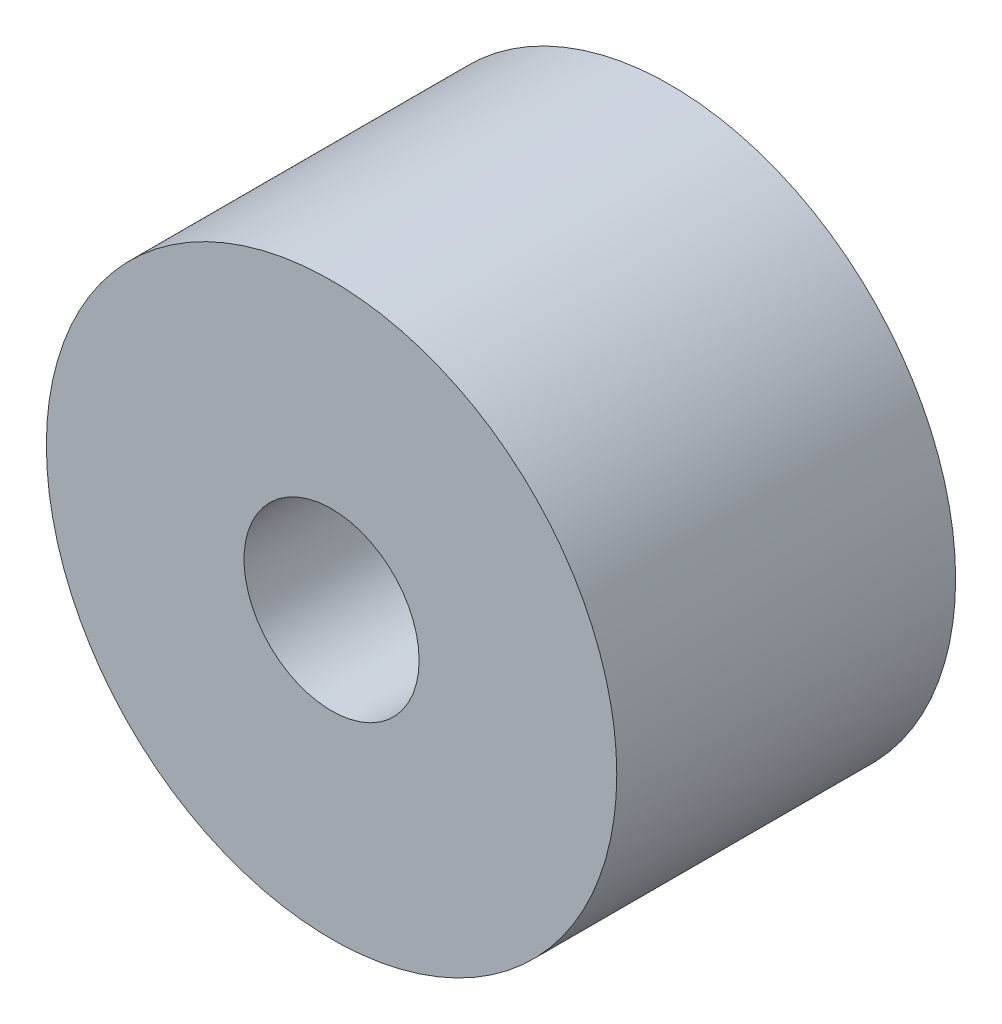
ISO-10303-21;
HEADER;
FILE_DESCRIPTION(('STEP AP214'),'2;1');
FILE_NAME('part.step','',(''),(''),'','','');
FILE_SCHEMA(('AUTOMOTIVE_DESIGN { 1 0 10303 214 1 1 1 1 }'));
ENDSEC;
DATA;
#1=APPLICATION_CONTEXT('core data for automotive mechanical design processes');
#2=APPLICATION_PROTOCOL_DEFINITION('international standard','automotive_design',2000,#1);
#3=PRODUCT_CONTEXT('',#1,'mechanical');
#4=PRODUCT('Part','Part','',(#3));
#5=PRODUCT_RELATED_PRODUCT_CATEGORY('part','',(#4));
#6=PRODUCT_DEFINITION_FORMATION('','',#4);
#7=PRODUCT_DEFINITION_CONTEXT('part definition',#1,'design');
#8=PRODUCT_DEFINITION('design','',#6,#7);
#9=PRODUCT_DEFINITION_SHAPE('','',#8);
#10=(LENGTH_UNIT() NAMED_UNIT(*) SI_UNIT(.MILLI.,.METRE.));
#11=(NAMED_UNIT(*) PLANE_ANGLE_UNIT() SI_UNIT($,.RADIAN.));
#12=(NAMED_UNIT(*) SI_UNIT($,.STERADIAN.) SOLID_ANGLE_UNIT());
#13=UNCERTAINTY_MEASURE_WITH_UNIT(LENGTH_MEASURE(1.E-05),#10,'distance_accuracy_value','');
#14=(GEOMETRIC_REPRESENTATION_CONTEXT(3) GLOBAL_UNCERTAINTY_ASSIGNED_CONTEXT((#13)) GLOBAL_UNIT_ASSIGNED_CONTEXT((#10,
#11,#12)) REPRESENTATION_CONTEXT('',''));
#15=CARTESIAN_POINT('',(0.,0.,0.));
#16=DIRECTION('',(0.,0.,1.));
#17=DIRECTION('',(1.,0.,0.));
#18=AXIS2_PLACEMENT_3D('',#15,#16,#17);
#19=CARTESIAN_POINT('',(200.527180246866,1578.67663788679,6.));
#20=DIRECTION('',(0.,0.,1.));
#21=DIRECTION('',(1.,0.,0.));
#22=AXIS2_PLACEMENT_3D('',#19,#20,#21);
#23=PLANE('',#22);
#24=CARTESIAN_POINT('',(200.527180246866,1578.67663788679,6.));
#25=DIRECTION('',(0.,0.,1.));
#26=DIRECTION('',(1.,0.,0.));
#27=AXIS2_PLACEMENT_3D('',#24,#25,#26);
#28=CIRCLE('',#27,5.04999999999998);
#29=CARTESIAN_POINT('',(205.577180246866,1578.67663788679,6.));
#30=VERTEX_POINT('',#29);
#31=EDGE_CURVE('E10',#30,#30,#28,.T.);
#32=ORIENTED_EDGE('',*,*,#31,.T.);
#33=EDGE_LOOP('',(#32));
#34=FACE_BOUND('',#33,.T.);
#35=CARTESIAN_POINT('',(200.527180246866,1578.67663788679,6.));
#36=DIRECTION('',(0.,0.,1.));
#37=DIRECTION('',(1.,0.,0.));
#38=AXIS2_PLACEMENT_3D('',#35,#36,#37);
#39=CIRCLE('',#38,1.55000000000002);
#40=CARTESIAN_POINT('',(202.077180246866,1578.67663788679,6.));
#41=VERTEX_POINT('',#40);
#42=EDGE_CURVE('E44',#41,#41,#39,.T.);
#43=ORIENTED_EDGE('',*,*,#42,.F.);
#44=EDGE_LOOP('',(#43));
#45=FACE_BOUND('',#44,.T.);
#46=ADVANCED_FACE('F33',(#34,#45),#23,.T.);
#47=CARTESIAN_POINT('',(200.527180246866,1578.67663788679,0.));
#48=DIRECTION('',(0.,0.,1.));
#49=DIRECTION('',(1.,0.,0.));
#50=AXIS2_PLACEMENT_3D('',#47,#48,#49);
#51=PLANE('',#50);
#52=CARTESIAN_POINT('',(200.527180246866,1578.67663788679,0.));
#53=DIRECTION('',(0.,0.,1.));
#54=DIRECTION('',(1.,0.,0.));
#55=AXIS2_PLACEMENT_3D('',#52,#53,#54);
#56=CIRCLE('',#55,5.04999999999998);
#57=CARTESIAN_POINT('',(205.577180246866,1578.67663788679,0.));
#58=VERTEX_POINT('',#57);
#59=EDGE_CURVE('E37',#58,#58,#56,.T.);
#60=ORIENTED_EDGE('',*,*,#59,.F.);
#61=EDGE_LOOP('',(#60));
#62=FACE_BOUND('',#61,.T.);
#63=CARTESIAN_POINT('',(200.527180246866,1578.67663788679,0.));
#64=DIRECTION('',(0.,0.,1.));
#65=DIRECTION('',(1.,0.,0.));
#66=AXIS2_PLACEMENT_3D('',#63,#64,#65);
#67=CIRCLE('',#66,1.55000000000002);
#68=CARTESIAN_POINT('',(202.077180246866,1578.67663788679,0.));
#69=VERTEX_POINT('',#68);
#70=EDGE_CURVE('E46',#69,#69,#67,.T.);
#71=ORIENTED_EDGE('',*,*,#70,.T.);
#72=EDGE_LOOP('',(#71));
#73=FACE_BOUND('',#72,.T.);
#74=ADVANCED_FACE('F56',(#62,#73),#51,.F.);
#75=CARTESIAN_POINT('',(200.527180246866,1578.67663788679,6.));
#76=DIRECTION('',(0.,0.,-1.));
#77=DIRECTION('',(-1.,0.,0.));
#78=AXIS2_PLACEMENT_3D('',#75,#76,#77);
#79=CYLINDRICAL_SURFACE('',#78,5.04999999999998);
#80=ORIENTED_EDGE('',*,*,#31,.F.);
#81=EDGE_LOOP('',(#80));
#82=FACE_BOUND('',#81,.T.);
#83=ORIENTED_EDGE('',*,*,#59,.T.);
#84=EDGE_LOOP('',(#83));
#85=FACE_BOUND('',#84,.T.);
#86=ADVANCED_FACE('F35',(#82,#85),#79,.T.);
#87=CARTESIAN_POINT('',(200.527180246866,1578.67663788679,6.));
#88=DIRECTION('',(0.,0.,-1.));
#89=DIRECTION('',(-1.,0.,0.));
#90=AXIS2_PLACEMENT_3D('',#87,#88,#89);
#91=CYLINDRICAL_SURFACE('',#90,1.55000000000002);
#92=ORIENTED_EDGE('',*,*,#42,.T.);
#93=EDGE_LOOP('',(#92));
#94=FACE_BOUND('',#93,.T.);
#95=ORIENTED_EDGE('',*,*,#70,.F.);
#96=EDGE_LOOP('',(#95));
#97=FACE_BOUND('',#96,.T.);
#98=ADVANCED_FACE('F52',(#94,#97),#91,.F.);
#99=CLOSED_SHELL('',(#46,#74,#86,#98));
#100=MANIFOLD_SOLID_BREP('B2',#99);
#101=ADVANCED_BREP_SHAPE_REPRESENTATION('',(#18,#100),#14);
#102=SHAPE_DEFINITION_REPRESENTATION(#9,#101);
ENDSEC;
END-ISO-10303-21;
